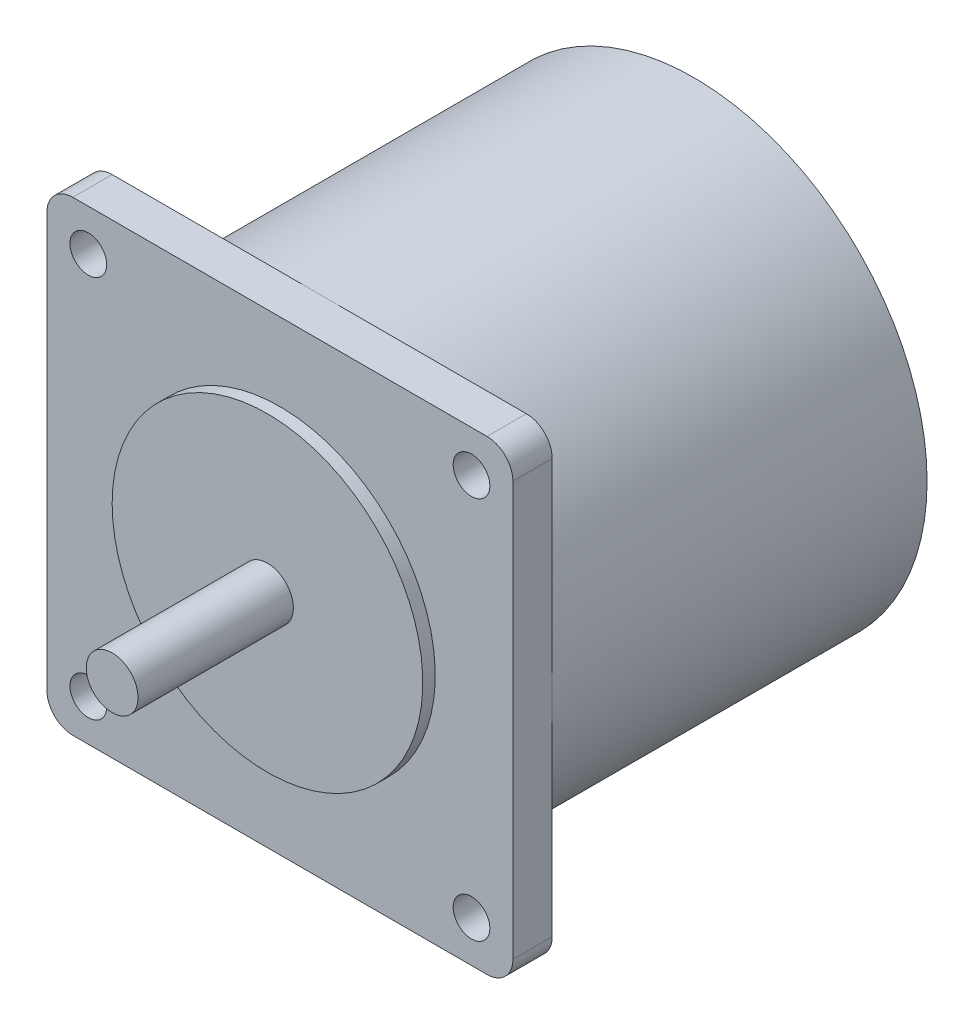
ISO-10303-21;
HEADER;
FILE_DESCRIPTION(('STEP AP214'),'2;1');
FILE_NAME('part.step','',(''),(''),'','','');
FILE_SCHEMA(('AUTOMOTIVE_DESIGN { 1 0 10303 214 1 1 1 1 }'));
ENDSEC;
DATA;
#1=APPLICATION_CONTEXT('core data for automotive mechanical design processes');
#2=APPLICATION_PROTOCOL_DEFINITION('international standard','automotive_design',2000,#1);
#3=PRODUCT_CONTEXT('',#1,'mechanical');
#4=PRODUCT('Part','Part','',(#3));
#5=PRODUCT_RELATED_PRODUCT_CATEGORY('part','',(#4));
#6=PRODUCT_DEFINITION_FORMATION('','',#4);
#7=PRODUCT_DEFINITION_CONTEXT('part definition',#1,'design');
#8=PRODUCT_DEFINITION('design','',#6,#7);
#9=PRODUCT_DEFINITION_SHAPE('','',#8);
#10=(LENGTH_UNIT() NAMED_UNIT(*) SI_UNIT(.MILLI.,.METRE.));
#11=(NAMED_UNIT(*) PLANE_ANGLE_UNIT() SI_UNIT($,.RADIAN.));
#12=(NAMED_UNIT(*) SI_UNIT($,.STERADIAN.) SOLID_ANGLE_UNIT());
#13=UNCERTAINTY_MEASURE_WITH_UNIT(LENGTH_MEASURE(1.E-05),#10,'distance_accuracy_value','');
#14=(GEOMETRIC_REPRESENTATION_CONTEXT(3) GLOBAL_UNCERTAINTY_ASSIGNED_CONTEXT((#13)) GLOBAL_UNIT_ASSIGNED_CONTEXT((#10,
#11,#12)) REPRESENTATION_CONTEXT('',''));
#15=CARTESIAN_POINT('',(0.,0.,0.));
#16=DIRECTION('',(0.,0.,1.));
#17=DIRECTION('',(1.,0.,0.));
#18=AXIS2_PLACEMENT_3D('',#15,#16,#17);
#19=CARTESIAN_POINT('',(0.,0.,0.));
#20=DIRECTION('',(0.,0.,-1.));
#21=DIRECTION('',(-1.,0.,0.));
#22=AXIS2_PLACEMENT_3D('',#19,#20,#21);
#23=PLANE('',#22);
#24=DIRECTION('',(0.,-1.,0.));
#25=VECTOR('',#24,1.);
#26=CARTESIAN_POINT('',(-28.575,-28.575,0.));
#27=LINE('',#26,#25);
#28=CARTESIAN_POINT('',(-28.575,25.4,0.));
#29=VERTEX_POINT('',#28);
#30=CARTESIAN_POINT('',(-28.575,-25.4,0.));
#31=VERTEX_POINT('',#30);
#32=EDGE_CURVE('E179',#29,#31,#27,.T.);
#33=ORIENTED_EDGE('',*,*,#32,.T.);
#34=CARTESIAN_POINT('',(-25.4,-25.4,0.));
#35=DIRECTION('',(0.,0.,-1.));
#36=DIRECTION('',(-1.,0.,0.));
#37=AXIS2_PLACEMENT_3D('',#34,#35,#36);
#38=CIRCLE('',#37,3.175);
#39=CARTESIAN_POINT('',(-25.4,-28.575,0.));
#40=VERTEX_POINT('',#39);
#41=EDGE_CURVE('E196',#31,#40,#38,.F.);
#42=ORIENTED_EDGE('',*,*,#41,.T.);
#43=DIRECTION('',(1.,0.,0.));
#44=VECTOR('',#43,1.);
#45=CARTESIAN_POINT('',(-28.575,-28.575,0.));
#46=LINE('',#45,#44);
#47=CARTESIAN_POINT('',(25.4,-28.575,0.));
#48=VERTEX_POINT('',#47);
#49=EDGE_CURVE('E182',#40,#48,#46,.T.);
#50=ORIENTED_EDGE('',*,*,#49,.T.);
#51=CARTESIAN_POINT('',(25.4,-25.4,0.));
#52=DIRECTION('',(0.,0.,-1.));
#53=DIRECTION('',(-1.,0.,0.));
#54=AXIS2_PLACEMENT_3D('',#51,#52,#53);
#55=CIRCLE('',#54,3.175);
#56=CARTESIAN_POINT('',(28.575,-25.4,0.));
#57=VERTEX_POINT('',#56);
#58=EDGE_CURVE('E192',#48,#57,#55,.F.);
#59=ORIENTED_EDGE('',*,*,#58,.T.);
#60=DIRECTION('',(0.,1.,0.));
#61=VECTOR('',#60,1.);
#62=CARTESIAN_POINT('',(28.575,-28.575,0.));
#63=LINE('',#62,#61);
#64=CARTESIAN_POINT('',(28.575,25.4,0.));
#65=VERTEX_POINT('',#64);
#66=EDGE_CURVE('E164',#57,#65,#63,.T.);
#67=ORIENTED_EDGE('',*,*,#66,.T.);
#68=CARTESIAN_POINT('',(25.4,25.4,0.));
#69=DIRECTION('',(0.,0.,-1.));
#70=DIRECTION('',(-1.,0.,0.));
#71=AXIS2_PLACEMENT_3D('',#68,#69,#70);
#72=CIRCLE('',#71,3.175);
#73=CARTESIAN_POINT('',(25.4,28.575,0.));
#74=VERTEX_POINT('',#73);
#75=EDGE_CURVE('E190',#65,#74,#72,.F.);
#76=ORIENTED_EDGE('',*,*,#75,.T.);
#77=DIRECTION('',(-1.,0.,0.));
#78=VECTOR('',#77,1.);
#79=CARTESIAN_POINT('',(-28.575,28.575,0.));
#80=LINE('',#79,#78);
#81=CARTESIAN_POINT('',(-25.4,28.575,0.));
#82=VERTEX_POINT('',#81);
#83=EDGE_CURVE('E176',#74,#82,#80,.T.);
#84=ORIENTED_EDGE('',*,*,#83,.T.);
#85=CARTESIAN_POINT('',(-25.4,25.4,0.));
#86=DIRECTION('',(0.,0.,-1.));
#87=DIRECTION('',(-1.,0.,0.));
#88=AXIS2_PLACEMENT_3D('',#85,#86,#87);
#89=CIRCLE('',#88,3.175);
#90=EDGE_CURVE('E194',#82,#29,#89,.F.);
#91=ORIENTED_EDGE('',*,*,#90,.T.);
#92=EDGE_LOOP('',(#33,#42,#50,#59,#67,#76,#84,#91));
#93=FACE_BOUND('',#92,.T.);
#94=CARTESIAN_POINT('',(0.,0.,0.));
#95=DIRECTION('',(0.,0.,1.));
#96=DIRECTION('',(1.,0.,0.));
#97=AXIS2_PLACEMENT_3D('',#94,#95,#96);
#98=CIRCLE('',#97,19.05);
#99=CARTESIAN_POINT('',(-19.05,0.,0.));
#100=VERTEX_POINT('',#99);
#101=EDGE_CURVE('E165',#100,#100,#98,.T.);
#102=ORIENTED_EDGE('',*,*,#101,.F.);
#103=EDGE_LOOP('',(#102));
#104=FACE_BOUND('',#103,.T.);
#105=CARTESIAN_POINT('',(-23.5000000000001,-23.5,0.));
#106=DIRECTION('',(0.,0.,1.));
#107=DIRECTION('',(1.,0.,0.));
#108=AXIS2_PLACEMENT_3D('',#105,#106,#107);
#109=CIRCLE('',#108,2.25);
#110=CARTESIAN_POINT('',(-21.2500000000001,-23.5,0.));
#111=VERTEX_POINT('',#110);
#112=EDGE_CURVE('E287',#111,#111,#109,.T.);
#113=ORIENTED_EDGE('',*,*,#112,.F.);
#114=EDGE_LOOP('',(#113));
#115=FACE_BOUND('',#114,.T.);
#116=CARTESIAN_POINT('',(23.5000000000001,-23.5,0.));
#117=DIRECTION('',(0.,0.,1.));
#118=DIRECTION('',(1.,0.,0.));
#119=AXIS2_PLACEMENT_3D('',#116,#117,#118);
#120=CIRCLE('',#119,2.25);
#121=CARTESIAN_POINT('',(25.7500000000001,-23.5,0.));
#122=VERTEX_POINT('',#121);
#123=EDGE_CURVE('E294',#122,#122,#120,.T.);
#124=ORIENTED_EDGE('',*,*,#123,.F.);
#125=EDGE_LOOP('',(#124));
#126=FACE_BOUND('',#125,.T.);
#127=CARTESIAN_POINT('',(23.5000000000001,23.5,0.));
#128=DIRECTION('',(0.,0.,1.));
#129=DIRECTION('',(1.,0.,0.));
#130=AXIS2_PLACEMENT_3D('',#127,#128,#129);
#131=CIRCLE('',#130,2.25);
#132=CARTESIAN_POINT('',(25.7500000000001,23.5,0.));
#133=VERTEX_POINT('',#132);
#134=EDGE_CURVE('E300',#133,#133,#131,.T.);
#135=ORIENTED_EDGE('',*,*,#134,.F.);
#136=EDGE_LOOP('',(#135));
#137=FACE_BOUND('',#136,.T.);
#138=CARTESIAN_POINT('',(-23.5000000000001,23.5,0.));
#139=DIRECTION('',(0.,0.,1.));
#140=DIRECTION('',(1.,0.,0.));
#141=AXIS2_PLACEMENT_3D('',#138,#139,#140);
#142=CIRCLE('',#141,2.25);
#143=CARTESIAN_POINT('',(-21.2500000000001,23.5,0.));
#144=VERTEX_POINT('',#143);
#145=EDGE_CURVE('E306',#144,#144,#142,.T.);
#146=ORIENTED_EDGE('',*,*,#145,.F.);
#147=EDGE_LOOP('',(#146));
#148=FACE_BOUND('',#147,.T.);
#149=ADVANCED_FACE('F34',(#93,#104,#115,#126,#137,#148),#23,.F.);
#150=CARTESIAN_POINT('',(0.,0.,-4.826));
#151=DIRECTION('',(0.,0.,-1.));
#152=DIRECTION('',(-1.,0.,0.));
#153=AXIS2_PLACEMENT_3D('',#150,#151,#152);
#154=PLANE('',#153);
#155=CARTESIAN_POINT('',(-23.5000000000001,23.5,-4.826));
#156=DIRECTION('',(0.,0.,-1.));
#157=DIRECTION('',(-1.,0.,0.));
#158=AXIS2_PLACEMENT_3D('',#155,#156,#157);
#159=CIRCLE('',#158,2.25);
#160=CARTESIAN_POINT('',(-25.7500000000001,23.5,-4.826));
#161=VERTEX_POINT('',#160);
#162=EDGE_CURVE('E303',#161,#161,#159,.T.);
#163=ORIENTED_EDGE('',*,*,#162,.F.);
#164=EDGE_LOOP('',(#163));
#165=FACE_BOUND('',#164,.T.);
#166=DIRECTION('',(0.,-1.,0.));
#167=VECTOR('',#166,1.);
#168=CARTESIAN_POINT('',(-28.575,-28.575,-4.826));
#169=LINE('',#168,#167);
#170=CARTESIAN_POINT('',(-28.575,25.4,-4.826));
#171=VERTEX_POINT('',#170);
#172=CARTESIAN_POINT('',(-28.575,0.,-4.826));
#173=VERTEX_POINT('',#172);
#174=EDGE_CURVE('E112',#171,#173,#169,.T.);
#175=ORIENTED_EDGE('',*,*,#174,.F.);
#176=CARTESIAN_POINT('',(-25.4,25.4,-4.826));
#177=DIRECTION('',(0.,0.,-1.));
#178=DIRECTION('',(-1.,0.,0.));
#179=AXIS2_PLACEMENT_3D('',#176,#177,#178);
#180=CIRCLE('',#179,3.175);
#181=CARTESIAN_POINT('',(-25.4,28.575,-4.826));
#182=VERTEX_POINT('',#181);
#183=EDGE_CURVE('E209',#171,#182,#180,.T.);
#184=ORIENTED_EDGE('',*,*,#183,.T.);
#185=DIRECTION('',(-1.,0.,0.));
#186=VECTOR('',#185,1.);
#187=CARTESIAN_POINT('',(-28.575,28.575,-4.826));
#188=LINE('',#187,#186);
#189=CARTESIAN_POINT('',(0.,28.575,-4.826));
#190=VERTEX_POINT('',#189);
#191=EDGE_CURVE('E141',#190,#182,#188,.T.);
#192=ORIENTED_EDGE('',*,*,#191,.F.);
#193=CARTESIAN_POINT('',(0.,0.,-4.826));
#194=DIRECTION('',(0.,0.,-1.));
#195=DIRECTION('',(-1.,0.,0.));
#196=AXIS2_PLACEMENT_3D('',#193,#194,#195);
#197=CIRCLE('',#196,28.575);
#198=EDGE_CURVE('E138',#173,#190,#197,.T.);
#199=ORIENTED_EDGE('',*,*,#198,.F.);
#200=EDGE_LOOP('',(#175,#184,#192,#199));
#201=FACE_BOUND('',#200,.T.);
#202=ADVANCED_FACE('F139',(#165,#201),#154,.T.);
#203=CARTESIAN_POINT('',(23.5000000000001,23.5,-4.826));
#204=DIRECTION('',(0.,0.,-1.));
#205=DIRECTION('',(-1.,0.,0.));
#206=AXIS2_PLACEMENT_3D('',#203,#204,#205);
#207=CIRCLE('',#206,2.25);
#208=CARTESIAN_POINT('',(21.2500000000001,23.5,-4.826));
#209=VERTEX_POINT('',#208);
#210=EDGE_CURVE('E297',#209,#209,#207,.T.);
#211=ORIENTED_EDGE('',*,*,#210,.F.);
#212=EDGE_LOOP('',(#211));
#213=FACE_BOUND('',#212,.T.);
#214=CARTESIAN_POINT('',(25.4,28.575,-4.826));
#215=VERTEX_POINT('',#214);
#216=EDGE_CURVE('E135',#215,#190,#188,.T.);
#217=ORIENTED_EDGE('',*,*,#216,.F.);
#218=CARTESIAN_POINT('',(25.4,25.4,-4.826));
#219=DIRECTION('',(0.,0.,-1.));
#220=DIRECTION('',(-1.,0.,0.));
#221=AXIS2_PLACEMENT_3D('',#218,#219,#220);
#222=CIRCLE('',#221,3.175);
#223=CARTESIAN_POINT('',(28.575,25.4,-4.826));
#224=VERTEX_POINT('',#223);
#225=EDGE_CURVE('E11',#215,#224,#222,.T.);
#226=ORIENTED_EDGE('',*,*,#225,.T.);
#227=DIRECTION('',(0.,1.,0.));
#228=VECTOR('',#227,1.);
#229=CARTESIAN_POINT('',(28.575,-28.575,-4.826));
#230=LINE('',#229,#228);
#231=CARTESIAN_POINT('',(28.575,0.,-4.826));
#232=VERTEX_POINT('',#231);
#233=EDGE_CURVE('E171',#232,#224,#230,.T.);
#234=ORIENTED_EDGE('',*,*,#233,.F.);
#235=EDGE_CURVE('E145',#190,#232,#197,.T.);
#236=ORIENTED_EDGE('',*,*,#235,.F.);
#237=EDGE_LOOP('',(#217,#226,#234,#236));
#238=FACE_BOUND('',#237,.T.);
#239=ADVANCED_FACE('F256',(#213,#238),#154,.T.);
#240=CARTESIAN_POINT('',(23.5000000000001,-23.5,-4.826));
#241=DIRECTION('',(0.,0.,-1.));
#242=DIRECTION('',(-1.,0.,0.));
#243=AXIS2_PLACEMENT_3D('',#240,#241,#242);
#244=CIRCLE('',#243,2.25);
#245=CARTESIAN_POINT('',(21.2500000000001,-23.5,-4.826));
#246=VERTEX_POINT('',#245);
#247=EDGE_CURVE('E289',#246,#246,#244,.T.);
#248=ORIENTED_EDGE('',*,*,#247,.F.);
#249=EDGE_LOOP('',(#248));
#250=FACE_BOUND('',#249,.T.);
#251=CARTESIAN_POINT('',(28.575,-25.4,-4.826));
#252=VERTEX_POINT('',#251);
#253=EDGE_CURVE('E169',#252,#232,#230,.T.);
#254=ORIENTED_EDGE('',*,*,#253,.F.);
#255=CARTESIAN_POINT('',(25.4,-25.4,-4.826));
#256=DIRECTION('',(0.,0.,-1.));
#257=DIRECTION('',(-1.,0.,0.));
#258=AXIS2_PLACEMENT_3D('',#255,#256,#257);
#259=CIRCLE('',#258,3.175);
#260=CARTESIAN_POINT('',(25.4,-28.575,-4.826));
#261=VERTEX_POINT('',#260);
#262=EDGE_CURVE('E42',#252,#261,#259,.T.);
#263=ORIENTED_EDGE('',*,*,#262,.T.);
#264=DIRECTION('',(1.,0.,0.));
#265=VECTOR('',#264,1.);
#266=CARTESIAN_POINT('',(-28.575,-28.575,-4.826));
#267=LINE('',#266,#265);
#268=CARTESIAN_POINT('',(0.,-28.575,-4.826));
#269=VERTEX_POINT('',#268);
#270=EDGE_CURVE('E124',#269,#261,#267,.T.);
#271=ORIENTED_EDGE('',*,*,#270,.F.);
#272=EDGE_CURVE('E151',#232,#269,#197,.T.);
#273=ORIENTED_EDGE('',*,*,#272,.F.);
#274=EDGE_LOOP('',(#254,#263,#271,#273));
#275=FACE_BOUND('',#274,.T.);
#276=ADVANCED_FACE('F217',(#250,#275),#154,.T.);
#277=CARTESIAN_POINT('',(28.575,-28.575,-4.826));
#278=DIRECTION('',(1.,0.,0.));
#279=DIRECTION('',(0.,0.,-1.));
#280=AXIS2_PLACEMENT_3D('',#277,#278,#279);
#281=PLANE('',#280);
#282=ORIENTED_EDGE('',*,*,#66,.F.);
#283=DIRECTION('',(0.,0.,1.));
#284=VECTOR('',#283,1.);
#285=CARTESIAN_POINT('',(28.575,-25.4,-4.826));
#286=LINE('',#285,#284);
#287=EDGE_CURVE('E55',#57,#252,#286,.F.);
#288=ORIENTED_EDGE('',*,*,#287,.T.);
#289=ORIENTED_EDGE('',*,*,#253,.T.);
#290=ORIENTED_EDGE('',*,*,#233,.T.);
#291=DIRECTION('',(0.,0.,1.));
#292=VECTOR('',#291,1.);
#293=CARTESIAN_POINT('',(28.575,25.4,-4.826));
#294=LINE('',#293,#292);
#295=EDGE_CURVE('E211',#224,#65,#294,.T.);
#296=ORIENTED_EDGE('',*,*,#295,.T.);
#297=EDGE_LOOP('',(#282,#288,#289,#290,#296));
#298=FACE_BOUND('',#297,.T.);
#299=ADVANCED_FACE('F226',(#298),#281,.T.);
#300=CARTESIAN_POINT('',(-28.575,-28.575,-4.826));
#301=DIRECTION('',(0.,-1.,0.));
#302=DIRECTION('',(0.,0.,-1.));
#303=AXIS2_PLACEMENT_3D('',#300,#301,#302);
#304=PLANE('',#303);
#305=ORIENTED_EDGE('',*,*,#49,.F.);
#306=DIRECTION('',(0.,0.,1.));
#307=VECTOR('',#306,1.);
#308=CARTESIAN_POINT('',(-25.4,-28.575,-4.826));
#309=LINE('',#308,#307);
#310=CARTESIAN_POINT('',(-25.4,-28.575,-4.826));
#311=VERTEX_POINT('',#310);
#312=EDGE_CURVE('E201',#40,#311,#309,.F.);
#313=ORIENTED_EDGE('',*,*,#312,.T.);
#314=EDGE_CURVE('E168',#311,#269,#267,.T.);
#315=ORIENTED_EDGE('',*,*,#314,.T.);
#316=ORIENTED_EDGE('',*,*,#270,.T.);
#317=DIRECTION('',(0.,0.,1.));
#318=VECTOR('',#317,1.);
#319=CARTESIAN_POINT('',(25.4,-28.575,-4.826));
#320=LINE('',#319,#318);
#321=EDGE_CURVE('E198',#261,#48,#320,.T.);
#322=ORIENTED_EDGE('',*,*,#321,.T.);
#323=EDGE_LOOP('',(#305,#313,#315,#316,#322));
#324=FACE_BOUND('',#323,.T.);
#325=ADVANCED_FACE('F222',(#324),#304,.T.);
#326=CARTESIAN_POINT('',(-28.575,-28.575,-4.826));
#327=DIRECTION('',(-1.,0.,0.));
#328=DIRECTION('',(0.,0.,1.));
#329=AXIS2_PLACEMENT_3D('',#326,#327,#328);
#330=PLANE('',#329);
#331=CARTESIAN_POINT('',(-28.575,-25.4,-4.826));
#332=VERTEX_POINT('',#331);
#333=EDGE_CURVE('E116',#173,#332,#169,.T.);
#334=ORIENTED_EDGE('',*,*,#333,.T.);
#335=DIRECTION('',(0.,0.,1.));
#336=VECTOR('',#335,1.);
#337=CARTESIAN_POINT('',(-28.575,-25.4,-4.826));
#338=LINE('',#337,#336);
#339=EDGE_CURVE('E188',#332,#31,#338,.T.);
#340=ORIENTED_EDGE('',*,*,#339,.T.);
#341=ORIENTED_EDGE('',*,*,#32,.F.);
#342=DIRECTION('',(0.,0.,1.));
#343=VECTOR('',#342,1.);
#344=CARTESIAN_POINT('',(-28.575,25.4,-4.826));
#345=LINE('',#344,#343);
#346=EDGE_CURVE('E120',#29,#171,#345,.F.);
#347=ORIENTED_EDGE('',*,*,#346,.T.);
#348=ORIENTED_EDGE('',*,*,#174,.T.);
#349=EDGE_LOOP('',(#334,#340,#341,#347,#348));
#350=FACE_BOUND('',#349,.T.);
#351=ADVANCED_FACE('F114',(#350),#330,.T.);
#352=CARTESIAN_POINT('',(-28.575,28.575,-4.826));
#353=DIRECTION('',(0.,1.,0.));
#354=DIRECTION('',(0.,0.,1.));
#355=AXIS2_PLACEMENT_3D('',#352,#353,#354);
#356=PLANE('',#355);
#357=ORIENTED_EDGE('',*,*,#191,.T.);
#358=DIRECTION('',(0.,0.,1.));
#359=VECTOR('',#358,1.);
#360=CARTESIAN_POINT('',(-25.4,28.575,-4.826));
#361=LINE('',#360,#359);
#362=EDGE_CURVE('E206',#182,#82,#361,.T.);
#363=ORIENTED_EDGE('',*,*,#362,.T.);
#364=ORIENTED_EDGE('',*,*,#83,.F.);
#365=DIRECTION('',(0.,0.,1.));
#366=VECTOR('',#365,1.);
#367=CARTESIAN_POINT('',(25.4,28.575,-4.826));
#368=LINE('',#367,#366);
#369=EDGE_CURVE('E204',#74,#215,#368,.F.);
#370=ORIENTED_EDGE('',*,*,#369,.T.);
#371=ORIENTED_EDGE('',*,*,#216,.T.);
#372=EDGE_LOOP('',(#357,#363,#364,#370,#371));
#373=FACE_BOUND('',#372,.T.);
#374=ADVANCED_FACE('F232',(#373),#356,.T.);
#375=CARTESIAN_POINT('',(-23.5000000000001,-23.5,-4.826));
#376=DIRECTION('',(0.,0.,-1.));
#377=DIRECTION('',(-1.,0.,0.));
#378=AXIS2_PLACEMENT_3D('',#375,#376,#377);
#379=CIRCLE('',#378,2.25);
#380=CARTESIAN_POINT('',(-25.7500000000001,-23.5,-4.826));
#381=VERTEX_POINT('',#380);
#382=EDGE_CURVE('E154',#381,#381,#379,.T.);
#383=ORIENTED_EDGE('',*,*,#382,.F.);
#384=EDGE_LOOP('',(#383));
#385=FACE_BOUND('',#384,.T.);
#386=ORIENTED_EDGE('',*,*,#314,.F.);
#387=CARTESIAN_POINT('',(-25.4,-25.4,-4.826));
#388=DIRECTION('',(0.,0.,-1.));
#389=DIRECTION('',(-1.,0.,0.));
#390=AXIS2_PLACEMENT_3D('',#387,#388,#389);
#391=CIRCLE('',#390,3.175);
#392=EDGE_CURVE('E134',#311,#332,#391,.T.);
#393=ORIENTED_EDGE('',*,*,#392,.T.);
#394=ORIENTED_EDGE('',*,*,#333,.F.);
#395=EDGE_CURVE('E131',#269,#173,#197,.T.);
#396=ORIENTED_EDGE('',*,*,#395,.F.);
#397=EDGE_LOOP('',(#386,#393,#394,#396));
#398=FACE_BOUND('',#397,.T.);
#399=ADVANCED_FACE('F129',(#385,#398),#154,.T.);
#400=CARTESIAN_POINT('',(0.,0.,1.524));
#401=DIRECTION('',(0.,0.,-1.));
#402=DIRECTION('',(-1.,0.,0.));
#403=AXIS2_PLACEMENT_3D('',#400,#401,#402);
#404=CYLINDRICAL_SURFACE('',#403,19.05);
#405=CARTESIAN_POINT('',(0.,0.,1.524));
#406=DIRECTION('',(0.,0.,1.));
#407=DIRECTION('',(1.,0.,0.));
#408=AXIS2_PLACEMENT_3D('',#405,#406,#407);
#409=CIRCLE('',#408,19.05);
#410=CARTESIAN_POINT('',(-19.05,0.,1.524));
#411=VERTEX_POINT('',#410);
#412=EDGE_CURVE('E161',#411,#411,#409,.T.);
#413=CARTESIAN_POINT('',(-19.05,0.,1.524));
#414=CARTESIAN_POINT('',(-19.05,0.,1.508125));
#415=CARTESIAN_POINT('',(-19.05,0.,1.49225));
#416=CARTESIAN_POINT('',(-19.05,0.,1.4605));
#417=CARTESIAN_POINT('',(-19.05,0.,1.444625));
#418=CARTESIAN_POINT('',(-19.05,0.,1.412875));
#419=CARTESIAN_POINT('',(-19.05,0.,1.397));
#420=CARTESIAN_POINT('',(-19.05,0.,1.36525));
#421=CARTESIAN_POINT('',(-19.05,0.,1.349375));
#422=CARTESIAN_POINT('',(-19.05,0.,1.317625));
#423=CARTESIAN_POINT('',(-19.05,0.,1.30175));
#424=CARTESIAN_POINT('',(-19.05,0.,1.27));
#425=CARTESIAN_POINT('',(-19.05,0.,1.254125));
#426=CARTESIAN_POINT('',(-19.05,0.,1.222375));
#427=CARTESIAN_POINT('',(-19.05,0.,1.2065));
#428=CARTESIAN_POINT('',(-19.05,0.,1.17475));
#429=CARTESIAN_POINT('',(-19.05,0.,1.158875));
#430=CARTESIAN_POINT('',(-19.05,0.,1.127125));
#431=CARTESIAN_POINT('',(-19.05,0.,1.11125));
#432=CARTESIAN_POINT('',(-19.05,0.,1.0795));
#433=CARTESIAN_POINT('',(-19.05,0.,1.063625));
#434=CARTESIAN_POINT('',(-19.05,0.,1.031875));
#435=CARTESIAN_POINT('',(-19.05,0.,1.016));
#436=CARTESIAN_POINT('',(-19.05,0.,0.98425));
#437=CARTESIAN_POINT('',(-19.05,0.,0.968375));
#438=CARTESIAN_POINT('',(-19.05,0.,0.936625));
#439=CARTESIAN_POINT('',(-19.05,0.,0.92075));
#440=CARTESIAN_POINT('',(-19.05,0.,0.889));
#441=CARTESIAN_POINT('',(-19.05,0.,0.873125));
#442=CARTESIAN_POINT('',(-19.05,0.,0.841375));
#443=CARTESIAN_POINT('',(-19.05,0.,0.8255));
#444=CARTESIAN_POINT('',(-19.05,0.,0.79375));
#445=CARTESIAN_POINT('',(-19.05,0.,0.777875));
#446=CARTESIAN_POINT('',(-19.05,0.,0.746125));
#447=CARTESIAN_POINT('',(-19.05,0.,0.73025));
#448=CARTESIAN_POINT('',(-19.05,0.,0.6985));
#449=CARTESIAN_POINT('',(-19.05,0.,0.682625));
#450=CARTESIAN_POINT('',(-19.05,0.,0.650875));
#451=CARTESIAN_POINT('',(-19.05,0.,0.635));
#452=CARTESIAN_POINT('',(-19.05,0.,0.60325));
#453=CARTESIAN_POINT('',(-19.05,0.,0.587375));
#454=CARTESIAN_POINT('',(-19.05,0.,0.555625));
#455=CARTESIAN_POINT('',(-19.05,0.,0.53975));
#456=CARTESIAN_POINT('',(-19.05,0.,0.508));
#457=CARTESIAN_POINT('',(-19.05,0.,0.492125));
#458=CARTESIAN_POINT('',(-19.05,0.,0.460375));
#459=CARTESIAN_POINT('',(-19.05,0.,0.4445));
#460=CARTESIAN_POINT('',(-19.05,0.,0.41275));
#461=CARTESIAN_POINT('',(-19.05,0.,0.396875));
#462=CARTESIAN_POINT('',(-19.05,0.,0.365125));
#463=CARTESIAN_POINT('',(-19.05,0.,0.34925));
#464=CARTESIAN_POINT('',(-19.05,0.,0.3175));
#465=CARTESIAN_POINT('',(-19.05,0.,0.301625));
#466=CARTESIAN_POINT('',(-19.05,0.,0.269875));
#467=CARTESIAN_POINT('',(-19.05,0.,0.254));
#468=CARTESIAN_POINT('',(-19.05,0.,0.22225));
#469=CARTESIAN_POINT('',(-19.05,0.,0.206375));
#470=CARTESIAN_POINT('',(-19.05,0.,0.174625));
#471=CARTESIAN_POINT('',(-19.05,0.,0.15875));
#472=CARTESIAN_POINT('',(-19.05,0.,0.127));
#473=CARTESIAN_POINT('',(-19.05,0.,0.111125));
#474=CARTESIAN_POINT('',(-19.05,0.,0.079375));
#475=CARTESIAN_POINT('',(-19.05,0.,0.0635));
#476=CARTESIAN_POINT('',(-19.05,0.,0.0317499999999999));
#477=CARTESIAN_POINT('',(-19.05,0.,0.015875));
#478=CARTESIAN_POINT('',(-19.05,0.,0.));
#479=B_SPLINE_CURVE_WITH_KNOTS('',3,(#413,#414,#415,#416,#417,#418,#419,#420,#421,#422,#423,
#424,#425,#426,#427,#428,#429,#430,#431,#432,#433,#434,#435,#436,#437,#438,#439,#440,#441,#442,
#443,#444,#445,#446,#447,#448,#449,#450,#451,#452,#453,#454,#455,#456,#457,#458,#459,#460,#461,
#462,#463,#464,#465,#466,#467,#468,#469,#470,#471,#472,#473,#474,#475,#476,#477,#478),
.UNSPECIFIED.,.F.,.F.,(4,2,2,2,2,2,2,2,2,2,2,2,2,2,2,2,2,2,2,2,2,2,2,2,2,2,2,2,2,2,2,2,4),(0.,
0.0476249999999999,0.0952499999999998,0.142875,0.1905,0.238125,0.28575,0.333375,0.381,0.428625,
0.47625,0.523875,0.5715,0.619125,0.66675,0.714375,0.762,0.809625,0.85725,0.904875,0.9525,
1.000125,1.04775,1.095375,1.143,1.190625,1.23825,1.285875,1.3335,1.381125,1.42875,1.476375,
1.524),.UNSPECIFIED.);
#480=EDGE_CURVE('BSEAM277',#411,#100,#479,.T.);
#481=ORIENTED_EDGE('',*,*,#412,.F.);
#482=ORIENTED_EDGE('',*,*,#101,.T.);
#483=ORIENTED_EDGE('',*,*,#480,.T.);
#484=ORIENTED_EDGE('',*,*,#480,.F.);
#485=EDGE_LOOP('',(#481,#483,#482,#484));
#486=FACE_BOUND('',#485,.T.);
#487=ADVANCED_FACE('F277',(#486),#404,.T.);
#488=CARTESIAN_POINT('',(0.,0.,1.524));
#489=DIRECTION('',(0.,0.,1.));
#490=DIRECTION('',(1.,0.,0.));
#491=AXIS2_PLACEMENT_3D('',#488,#489,#490);
#492=PLANE('',#491);
#493=CARTESIAN_POINT('',(0.,0.,1.524));
#494=DIRECTION('',(0.,0.,1.));
#495=DIRECTION('',(1.,0.,0.));
#496=AXIS2_PLACEMENT_3D('',#493,#494,#495);
#497=CIRCLE('',#496,3.175);
#498=CARTESIAN_POINT('',(3.175,0.,1.524));
#499=VERTEX_POINT('',#498);
#500=EDGE_CURVE('E160',#499,#499,#497,.F.);
#501=ORIENTED_EDGE('',*,*,#500,.T.);
#502=EDGE_LOOP('',(#501));
#503=FACE_BOUND('',#502,.T.);
#504=ORIENTED_EDGE('',*,*,#412,.T.);
#505=EDGE_LOOP('',(#504));
#506=FACE_BOUND('',#505,.T.);
#507=ADVANCED_FACE('F282',(#503,#506),#492,.T.);
#508=CARTESIAN_POINT('',(0.,0.,20.574));
#509=DIRECTION('',(0.,0.,-1.));
#510=DIRECTION('',(-1.,0.,0.));
#511=AXIS2_PLACEMENT_3D('',#508,#509,#510);
#512=CYLINDRICAL_SURFACE('',#511,3.175);
#513=ORIENTED_EDGE('',*,*,#500,.F.);
#514=EDGE_LOOP('',(#513));
#515=FACE_BOUND('',#514,.T.);
#516=CARTESIAN_POINT('',(0.,0.,20.574));
#517=DIRECTION('',(0.,0.,1.));
#518=DIRECTION('',(1.,0.,0.));
#519=AXIS2_PLACEMENT_3D('',#516,#517,#518);
#520=CIRCLE('',#519,3.175);
#521=CARTESIAN_POINT('',(3.175,0.,20.574));
#522=VERTEX_POINT('',#521);
#523=EDGE_CURVE('E144',#522,#522,#520,.T.);
#524=ORIENTED_EDGE('',*,*,#523,.F.);
#525=EDGE_LOOP('',(#524));
#526=FACE_BOUND('',#525,.T.);
#527=ADVANCED_FACE('F340',(#515,#526),#512,.T.);
#528=CARTESIAN_POINT('',(0.,0.,20.574));
#529=DIRECTION('',(0.,0.,1.));
#530=DIRECTION('',(1.,0.,0.));
#531=AXIS2_PLACEMENT_3D('',#528,#529,#530);
#532=PLANE('',#531);
#533=ORIENTED_EDGE('',*,*,#523,.T.);
#534=EDGE_LOOP('',(#533));
#535=FACE_BOUND('',#534,.T.);
#536=ADVANCED_FACE('F337',(#535),#532,.T.);
#537=CARTESIAN_POINT('',(0.,0.,-50.8));
#538=DIRECTION('',(0.,0.,1.));
#539=DIRECTION('',(1.,0.,0.));
#540=AXIS2_PLACEMENT_3D('',#537,#538,#539);
#541=CYLINDRICAL_SURFACE('',#540,28.575);
#542=ORIENTED_EDGE('',*,*,#395,.T.);
#543=ORIENTED_EDGE('',*,*,#198,.T.);
#544=ORIENTED_EDGE('',*,*,#235,.T.);
#545=ORIENTED_EDGE('',*,*,#272,.T.);
#546=EDGE_LOOP('',(#542,#543,#544,#545));
#547=FACE_BOUND('',#546,.T.);
#548=CARTESIAN_POINT('',(0.,0.,-50.8));
#549=DIRECTION('',(0.,0.,1.));
#550=DIRECTION('',(1.,0.,0.));
#551=AXIS2_PLACEMENT_3D('',#548,#549,#550);
#552=CIRCLE('',#551,28.575);
#553=CARTESIAN_POINT('',(28.575,0.,-50.8));
#554=VERTEX_POINT('',#553);
#555=EDGE_CURVE('E152',#554,#554,#552,.T.);
#556=ORIENTED_EDGE('',*,*,#555,.T.);
#557=EDGE_LOOP('',(#556));
#558=FACE_BOUND('',#557,.T.);
#559=ADVANCED_FACE('F148',(#547,#558),#541,.T.);
#560=CARTESIAN_POINT('',(0.,0.,-50.8));
#561=DIRECTION('',(0.,0.,1.));
#562=DIRECTION('',(1.,0.,0.));
#563=AXIS2_PLACEMENT_3D('',#560,#561,#562);
#564=PLANE('',#563);
#565=ORIENTED_EDGE('',*,*,#555,.F.);
#566=EDGE_LOOP('',(#565));
#567=FACE_BOUND('',#566,.T.);
#568=ADVANCED_FACE('F330',(#567),#564,.F.);
#569=CARTESIAN_POINT('',(-23.5000000000001,-23.5,0.));
#570=DIRECTION('',(0.,0.,1.));
#571=DIRECTION('',(1.,0.,0.));
#572=AXIS2_PLACEMENT_3D('',#569,#570,#571);
#573=CYLINDRICAL_SURFACE('',#572,2.25);
#574=ORIENTED_EDGE('',*,*,#112,.T.);
#575=EDGE_LOOP('',(#574));
#576=FACE_BOUND('',#575,.T.);
#577=ORIENTED_EDGE('',*,*,#382,.T.);
#578=EDGE_LOOP('',(#577));
#579=FACE_BOUND('',#578,.T.);
#580=ADVANCED_FACE('F324',(#576,#579),#573,.F.);
#581=CARTESIAN_POINT('',(23.5000000000001,-23.5,0.));
#582=DIRECTION('',(0.,0.,1.));
#583=DIRECTION('',(1.,0.,0.));
#584=AXIS2_PLACEMENT_3D('',#581,#582,#583);
#585=CYLINDRICAL_SURFACE('',#584,2.25);
#586=ORIENTED_EDGE('',*,*,#123,.T.);
#587=EDGE_LOOP('',(#586));
#588=FACE_BOUND('',#587,.T.);
#589=ORIENTED_EDGE('',*,*,#247,.T.);
#590=EDGE_LOOP('',(#589));
#591=FACE_BOUND('',#590,.T.);
#592=ADVANCED_FACE('F317',(#588,#591),#585,.F.);
#593=CARTESIAN_POINT('',(23.5000000000001,23.5,0.));
#594=DIRECTION('',(0.,0.,1.));
#595=DIRECTION('',(1.,0.,0.));
#596=AXIS2_PLACEMENT_3D('',#593,#594,#595);
#597=CYLINDRICAL_SURFACE('',#596,2.25);
#598=ORIENTED_EDGE('',*,*,#134,.T.);
#599=EDGE_LOOP('',(#598));
#600=FACE_BOUND('',#599,.T.);
#601=ORIENTED_EDGE('',*,*,#210,.T.);
#602=EDGE_LOOP('',(#601));
#603=FACE_BOUND('',#602,.T.);
#604=ADVANCED_FACE('F247',(#600,#603),#597,.F.);
#605=CARTESIAN_POINT('',(-23.5000000000001,23.5,0.));
#606=DIRECTION('',(0.,0.,1.));
#607=DIRECTION('',(1.,0.,0.));
#608=AXIS2_PLACEMENT_3D('',#605,#606,#607);
#609=CYLINDRICAL_SURFACE('',#608,2.25);
#610=ORIENTED_EDGE('',*,*,#145,.T.);
#611=EDGE_LOOP('',(#610));
#612=FACE_BOUND('',#611,.T.);
#613=ORIENTED_EDGE('',*,*,#162,.T.);
#614=EDGE_LOOP('',(#613));
#615=FACE_BOUND('',#614,.T.);
#616=ADVANCED_FACE('F240',(#612,#615),#609,.F.);
#617=CARTESIAN_POINT('',(-25.4,-25.4,-4.826));
#618=DIRECTION('',(0.,0.,1.));
#619=DIRECTION('',(1.,0.,0.));
#620=AXIS2_PLACEMENT_3D('',#617,#618,#619);
#621=CYLINDRICAL_SURFACE('',#620,3.175);
#622=ORIENTED_EDGE('',*,*,#392,.F.);
#623=ORIENTED_EDGE('',*,*,#312,.F.);
#624=ORIENTED_EDGE('',*,*,#41,.F.);
#625=ORIENTED_EDGE('',*,*,#339,.F.);
#626=EDGE_LOOP('',(#622,#623,#624,#625));
#627=FACE_BOUND('',#626,.T.);
#628=ADVANCED_FACE('F237',(#627),#621,.T.);
#629=CARTESIAN_POINT('',(-25.4,25.4,-4.826));
#630=DIRECTION('',(0.,0.,1.));
#631=DIRECTION('',(1.,0.,0.));
#632=AXIS2_PLACEMENT_3D('',#629,#630,#631);
#633=CYLINDRICAL_SURFACE('',#632,3.175);
#634=ORIENTED_EDGE('',*,*,#183,.F.);
#635=ORIENTED_EDGE('',*,*,#346,.F.);
#636=ORIENTED_EDGE('',*,*,#90,.F.);
#637=ORIENTED_EDGE('',*,*,#362,.F.);
#638=EDGE_LOOP('',(#634,#635,#636,#637));
#639=FACE_BOUND('',#638,.T.);
#640=ADVANCED_FACE('F235',(#639),#633,.T.);
#641=CARTESIAN_POINT('',(25.4,-25.4,-4.826));
#642=DIRECTION('',(0.,0.,1.));
#643=DIRECTION('',(1.,0.,0.));
#644=AXIS2_PLACEMENT_3D('',#641,#642,#643);
#645=CYLINDRICAL_SURFACE('',#644,3.175);
#646=ORIENTED_EDGE('',*,*,#262,.F.);
#647=ORIENTED_EDGE('',*,*,#287,.F.);
#648=ORIENTED_EDGE('',*,*,#58,.F.);
#649=ORIENTED_EDGE('',*,*,#321,.F.);
#650=EDGE_LOOP('',(#646,#647,#648,#649));
#651=FACE_BOUND('',#650,.T.);
#652=ADVANCED_FACE('F223',(#651),#645,.T.);
#653=CARTESIAN_POINT('',(25.4,25.4,-4.826));
#654=DIRECTION('',(0.,0.,1.));
#655=DIRECTION('',(1.,0.,0.));
#656=AXIS2_PLACEMENT_3D('',#653,#654,#655);
#657=CYLINDRICAL_SURFACE('',#656,3.175);
#658=ORIENTED_EDGE('',*,*,#225,.F.);
#659=ORIENTED_EDGE('',*,*,#369,.F.);
#660=ORIENTED_EDGE('',*,*,#75,.F.);
#661=ORIENTED_EDGE('',*,*,#295,.F.);
#662=EDGE_LOOP('',(#658,#659,#660,#661));
#663=FACE_BOUND('',#662,.T.);
#664=ADVANCED_FACE('F36',(#663),#657,.T.);
#665=CLOSED_SHELL('',(#149,#202,#239,#276,#299,#325,#351,#374,#399,#487,#507,#527,#536,#559,
#568,#580,#592,#604,#616,#628,#640,#652,#664));
#666=MANIFOLD_SOLID_BREP('B2',#665);
#667=ADVANCED_BREP_SHAPE_REPRESENTATION('',(#18,#666),#14);
#668=SHAPE_DEFINITION_REPRESENTATION(#9,#667);
ENDSEC;
END-ISO-10303-21;
